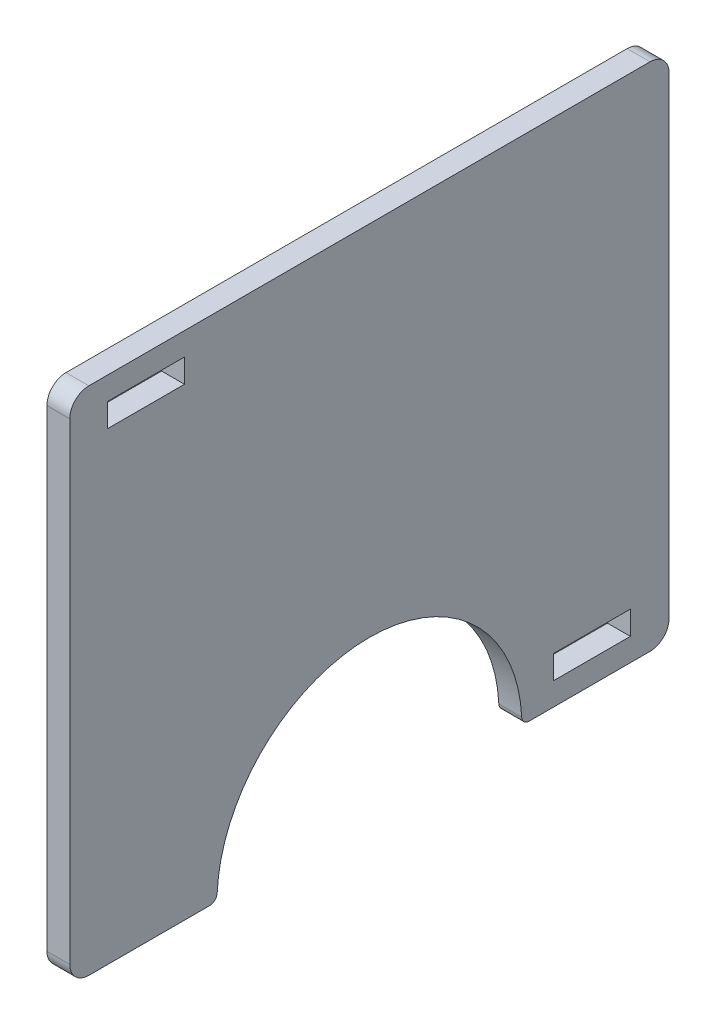
ISO-10303-21;
HEADER;
FILE_DESCRIPTION(('STEP AP214'),'2;1');
FILE_NAME('part.step','',(''),(''),'','','');
FILE_SCHEMA(('AUTOMOTIVE_DESIGN { 1 0 10303 214 1 1 1 1 }'));
ENDSEC;
DATA;
#1=APPLICATION_CONTEXT('core data for automotive mechanical design processes');
#2=APPLICATION_PROTOCOL_DEFINITION('international standard','automotive_design',2000,#1);
#3=PRODUCT_CONTEXT('',#1,'mechanical');
#4=PRODUCT('Part','Part','',(#3));
#5=PRODUCT_RELATED_PRODUCT_CATEGORY('part','',(#4));
#6=PRODUCT_DEFINITION_FORMATION('','',#4);
#7=PRODUCT_DEFINITION_CONTEXT('part definition',#1,'design');
#8=PRODUCT_DEFINITION('design','',#6,#7);
#9=PRODUCT_DEFINITION_SHAPE('','',#8);
#10=(LENGTH_UNIT() NAMED_UNIT(*) SI_UNIT(.MILLI.,.METRE.));
#11=(NAMED_UNIT(*) PLANE_ANGLE_UNIT() SI_UNIT($,.RADIAN.));
#12=(NAMED_UNIT(*) SI_UNIT($,.STERADIAN.) SOLID_ANGLE_UNIT());
#13=UNCERTAINTY_MEASURE_WITH_UNIT(LENGTH_MEASURE(1.E-05),#10,'distance_accuracy_value','');
#14=(GEOMETRIC_REPRESENTATION_CONTEXT(3) GLOBAL_UNCERTAINTY_ASSIGNED_CONTEXT((#13)) GLOBAL_UNIT_ASSIGNED_CONTEXT((#10,
#11,#12)) REPRESENTATION_CONTEXT('',''));
#15=CARTESIAN_POINT('',(0.,0.,0.));
#16=DIRECTION('',(0.,0.,1.));
#17=DIRECTION('',(1.,0.,0.));
#18=AXIS2_PLACEMENT_3D('',#15,#16,#17);
#19=CARTESIAN_POINT('',(3.,-33.5,36.82));
#20=DIRECTION('',(0.,1.,0.));
#21=DIRECTION('',(0.,0.,1.));
#22=AXIS2_PLACEMENT_3D('',#19,#20,#21);
#23=PLANE('',#22);
#24=DIRECTION('',(0.,0.,-1.));
#25=VECTOR('',#24,1.);
#26=CARTESIAN_POINT('',(0.,-33.5,36.82));
#27=LINE('',#26,#25);
#28=CARTESIAN_POINT('',(0.,-33.5,36.82));
#29=VERTEX_POINT('',#28);
#30=CARTESIAN_POINT('',(0.,-33.5,20.9761769634031));
#31=VERTEX_POINT('',#30);
#32=EDGE_CURVE('E274',#29,#31,#27,.T.);
#33=ORIENTED_EDGE('',*,*,#32,.T.);
#34=DIRECTION('',(1.,0.,0.));
#35=VECTOR('',#34,1.);
#36=CARTESIAN_POINT('',(3.,-33.5,20.9761769634031));
#37=LINE('',#36,#35);
#38=CARTESIAN_POINT('',(3.,-33.5,20.9761769634031));
#39=VERTEX_POINT('',#38);
#40=EDGE_CURVE('E11',#31,#39,#37,.T.);
#41=ORIENTED_EDGE('',*,*,#40,.T.);
#42=DIRECTION('',(0.,0.,-1.));
#43=VECTOR('',#42,1.);
#44=CARTESIAN_POINT('',(3.,-33.5,36.82));
#45=LINE('',#44,#43);
#46=CARTESIAN_POINT('',(3.,-33.5,36.82));
#47=VERTEX_POINT('',#46);
#48=EDGE_CURVE('E256',#47,#39,#45,.T.);
#49=ORIENTED_EDGE('',*,*,#48,.F.);
#50=DIRECTION('',(-1.,0.,0.));
#51=VECTOR('',#50,1.);
#52=CARTESIAN_POINT('',(3.,-33.5,36.82));
#53=LINE('',#52,#51);
#54=EDGE_CURVE('E308',#47,#29,#53,.T.);
#55=ORIENTED_EDGE('',*,*,#54,.T.);
#56=EDGE_LOOP('',(#33,#41,#49,#55));
#57=FACE_BOUND('',#56,.T.);
#58=ADVANCED_FACE('F33',(#57),#23,.F.);
#59=CARTESIAN_POINT('',(3.,-31.,36.82));
#60=DIRECTION('',(-1.,0.,0.));
#61=DIRECTION('',(0.,0.,1.));
#62=AXIS2_PLACEMENT_3D('',#59,#60,#61);
#63=CYLINDRICAL_SURFACE('',#62,2.5);
#64=CARTESIAN_POINT('',(0.,-31.,36.82));
#65=DIRECTION('',(1.,0.,0.));
#66=DIRECTION('',(0.,0.,-1.));
#67=AXIS2_PLACEMENT_3D('',#64,#65,#66);
#68=CIRCLE('',#67,2.5);
#69=CARTESIAN_POINT('',(0.,-31.,39.32));
#70=VERTEX_POINT('',#69);
#71=EDGE_CURVE('E250',#70,#29,#68,.T.);
#72=ORIENTED_EDGE('',*,*,#71,.T.);
#73=ORIENTED_EDGE('',*,*,#54,.F.);
#74=CARTESIAN_POINT('',(3.,-31.,36.82));
#75=DIRECTION('',(1.,0.,0.));
#76=DIRECTION('',(0.,0.,-1.));
#77=AXIS2_PLACEMENT_3D('',#74,#75,#76);
#78=CIRCLE('',#77,2.5);
#79=CARTESIAN_POINT('',(3.,-31.,39.32));
#80=VERTEX_POINT('',#79);
#81=EDGE_CURVE('E251',#80,#47,#78,.T.);
#82=ORIENTED_EDGE('',*,*,#81,.F.);
#83=DIRECTION('',(-1.,0.,0.));
#84=VECTOR('',#83,1.);
#85=CARTESIAN_POINT('',(3.,-31.,39.32));
#86=LINE('',#85,#84);
#87=EDGE_CURVE('E270',#80,#70,#86,.T.);
#88=ORIENTED_EDGE('',*,*,#87,.T.);
#89=EDGE_LOOP('',(#72,#73,#82,#88));
#90=FACE_BOUND('',#89,.T.);
#91=ADVANCED_FACE('F344',(#90),#63,.T.);
#92=CARTESIAN_POINT('',(3.,-33.5,-20.976176963403));
#93=VERTEX_POINT('',#92);
#94=CARTESIAN_POINT('',(3.,-33.5,-36.82));
#95=VERTEX_POINT('',#94);
#96=EDGE_CURVE('E254',#93,#95,#45,.T.);
#97=ORIENTED_EDGE('',*,*,#96,.F.);
#98=DIRECTION('',(1.,0.,0.));
#99=VECTOR('',#98,1.);
#100=CARTESIAN_POINT('',(3.,-33.5,-20.976176963403));
#101=LINE('',#100,#99);
#102=CARTESIAN_POINT('',(0.,-33.5,-20.976176963403));
#103=VERTEX_POINT('',#102);
#104=EDGE_CURVE('E311',#93,#103,#101,.F.);
#105=ORIENTED_EDGE('',*,*,#104,.T.);
#106=CARTESIAN_POINT('',(0.,-33.5,-36.82));
#107=VERTEX_POINT('',#106);
#108=EDGE_CURVE('E273',#103,#107,#27,.T.);
#109=ORIENTED_EDGE('',*,*,#108,.T.);
#110=DIRECTION('',(-1.,0.,0.));
#111=VECTOR('',#110,1.);
#112=CARTESIAN_POINT('',(3.,-33.5,-36.82));
#113=LINE('',#112,#111);
#114=EDGE_CURVE('E305',#95,#107,#113,.T.);
#115=ORIENTED_EDGE('',*,*,#114,.F.);
#116=EDGE_LOOP('',(#97,#105,#109,#115));
#117=FACE_BOUND('',#116,.T.);
#118=ADVANCED_FACE('F330',(#117),#23,.F.);
#119=CARTESIAN_POINT('',(3.,-31.,-36.82));
#120=DIRECTION('',(-1.,0.,0.));
#121=DIRECTION('',(0.,0.,1.));
#122=AXIS2_PLACEMENT_3D('',#119,#120,#121);
#123=CYLINDRICAL_SURFACE('',#122,2.5);
#124=CARTESIAN_POINT('',(0.,-31.,-36.82));
#125=DIRECTION('',(1.,0.,0.));
#126=DIRECTION('',(0.,0.,-1.));
#127=AXIS2_PLACEMENT_3D('',#124,#125,#126);
#128=CIRCLE('',#127,2.5);
#129=CARTESIAN_POINT('',(0.,-31.,-39.32));
#130=VERTEX_POINT('',#129);
#131=EDGE_CURVE('E277',#107,#130,#128,.T.);
#132=ORIENTED_EDGE('',*,*,#131,.T.);
#133=DIRECTION('',(-1.,0.,0.));
#134=VECTOR('',#133,1.);
#135=CARTESIAN_POINT('',(3.,-31.,-39.32));
#136=LINE('',#135,#134);
#137=CARTESIAN_POINT('',(3.,-31.,-39.32));
#138=VERTEX_POINT('',#137);
#139=EDGE_CURVE('E302',#138,#130,#136,.T.);
#140=ORIENTED_EDGE('',*,*,#139,.F.);
#141=CARTESIAN_POINT('',(3.,-31.,-36.82));
#142=DIRECTION('',(1.,0.,0.));
#143=DIRECTION('',(0.,0.,-1.));
#144=AXIS2_PLACEMENT_3D('',#141,#142,#143);
#145=CIRCLE('',#144,2.5);
#146=EDGE_CURVE('E258',#95,#138,#145,.T.);
#147=ORIENTED_EDGE('',*,*,#146,.F.);
#148=ORIENTED_EDGE('',*,*,#114,.T.);
#149=EDGE_LOOP('',(#132,#140,#147,#148));
#150=FACE_BOUND('',#149,.T.);
#151=ADVANCED_FACE('F372',(#150),#123,.T.);
#152=CARTESIAN_POINT('',(3.,31.,-39.32));
#153=DIRECTION('',(0.,0.,1.));
#154=DIRECTION('',(1.,0.,0.));
#155=AXIS2_PLACEMENT_3D('',#152,#153,#154);
#156=PLANE('',#155);
#157=DIRECTION('',(0.,1.,0.));
#158=VECTOR('',#157,1.);
#159=CARTESIAN_POINT('',(0.,31.,-39.32));
#160=LINE('',#159,#158);
#161=CARTESIAN_POINT('',(0.,31.,-39.32));
#162=VERTEX_POINT('',#161);
#163=EDGE_CURVE('E279',#130,#162,#160,.T.);
#164=ORIENTED_EDGE('',*,*,#163,.T.);
#165=DIRECTION('',(-1.,0.,0.));
#166=VECTOR('',#165,1.);
#167=CARTESIAN_POINT('',(3.,31.,-39.32));
#168=LINE('',#167,#166);
#169=CARTESIAN_POINT('',(3.,31.,-39.32));
#170=VERTEX_POINT('',#169);
#171=EDGE_CURVE('E299',#170,#162,#168,.T.);
#172=ORIENTED_EDGE('',*,*,#171,.F.);
#173=DIRECTION('',(0.,1.,0.));
#174=VECTOR('',#173,1.);
#175=CARTESIAN_POINT('',(3.,31.,-39.32));
#176=LINE('',#175,#174);
#177=EDGE_CURVE('E260',#138,#170,#176,.T.);
#178=ORIENTED_EDGE('',*,*,#177,.F.);
#179=ORIENTED_EDGE('',*,*,#139,.T.);
#180=EDGE_LOOP('',(#164,#172,#178,#179));
#181=FACE_BOUND('',#180,.T.);
#182=ADVANCED_FACE('F369',(#181),#156,.F.);
#183=CARTESIAN_POINT('',(3.,31.,-36.82));
#184=DIRECTION('',(-1.,0.,0.));
#185=DIRECTION('',(0.,0.,1.));
#186=AXIS2_PLACEMENT_3D('',#183,#184,#185);
#187=CYLINDRICAL_SURFACE('',#186,2.5);
#188=CARTESIAN_POINT('',(0.,31.,-36.82));
#189=DIRECTION('',(1.,0.,0.));
#190=DIRECTION('',(0.,0.,1.));
#191=AXIS2_PLACEMENT_3D('',#188,#189,#190);
#192=CIRCLE('',#191,2.5);
#193=CARTESIAN_POINT('',(0.,33.5,-36.82));
#194=VERTEX_POINT('',#193);
#195=EDGE_CURVE('E281',#162,#194,#192,.T.);
#196=ORIENTED_EDGE('',*,*,#195,.T.);
#197=DIRECTION('',(-1.,0.,0.));
#198=VECTOR('',#197,1.);
#199=CARTESIAN_POINT('',(3.,33.5,-36.82));
#200=LINE('',#199,#198);
#201=CARTESIAN_POINT('',(3.,33.5,-36.82));
#202=VERTEX_POINT('',#201);
#203=EDGE_CURVE('E296',#202,#194,#200,.T.);
#204=ORIENTED_EDGE('',*,*,#203,.F.);
#205=CARTESIAN_POINT('',(3.,31.,-36.82));
#206=DIRECTION('',(1.,0.,0.));
#207=DIRECTION('',(0.,0.,1.));
#208=AXIS2_PLACEMENT_3D('',#205,#206,#207);
#209=CIRCLE('',#208,2.5);
#210=EDGE_CURVE('E262',#170,#202,#209,.T.);
#211=ORIENTED_EDGE('',*,*,#210,.F.);
#212=ORIENTED_EDGE('',*,*,#171,.T.);
#213=EDGE_LOOP('',(#196,#204,#211,#212));
#214=FACE_BOUND('',#213,.T.);
#215=ADVANCED_FACE('F364',(#214),#187,.T.);
#216=CARTESIAN_POINT('',(3.,33.5,36.82));
#217=DIRECTION('',(0.,-1.,0.));
#218=DIRECTION('',(0.,0.,-1.));
#219=AXIS2_PLACEMENT_3D('',#216,#217,#218);
#220=PLANE('',#219);
#221=DIRECTION('',(0.,0.,1.));
#222=VECTOR('',#221,1.);
#223=CARTESIAN_POINT('',(0.,33.5,36.82));
#224=LINE('',#223,#222);
#225=CARTESIAN_POINT('',(0.,33.5,36.82));
#226=VERTEX_POINT('',#225);
#227=EDGE_CURVE('E283',#194,#226,#224,.T.);
#228=ORIENTED_EDGE('',*,*,#227,.T.);
#229=DIRECTION('',(-1.,0.,0.));
#230=VECTOR('',#229,1.);
#231=CARTESIAN_POINT('',(3.,33.5,36.82));
#232=LINE('',#231,#230);
#233=CARTESIAN_POINT('',(3.,33.5,36.82));
#234=VERTEX_POINT('',#233);
#235=EDGE_CURVE('E293',#234,#226,#232,.T.);
#236=ORIENTED_EDGE('',*,*,#235,.F.);
#237=DIRECTION('',(0.,0.,1.));
#238=VECTOR('',#237,1.);
#239=CARTESIAN_POINT('',(3.,33.5,36.82));
#240=LINE('',#239,#238);
#241=EDGE_CURVE('E264',#202,#234,#240,.T.);
#242=ORIENTED_EDGE('',*,*,#241,.F.);
#243=ORIENTED_EDGE('',*,*,#203,.T.);
#244=EDGE_LOOP('',(#228,#236,#242,#243));
#245=FACE_BOUND('',#244,.T.);
#246=ADVANCED_FACE('F359',(#245),#220,.F.);
#247=CARTESIAN_POINT('',(3.,31.,36.82));
#248=DIRECTION('',(-1.,0.,0.));
#249=DIRECTION('',(0.,0.,1.));
#250=AXIS2_PLACEMENT_3D('',#247,#248,#249);
#251=CYLINDRICAL_SURFACE('',#250,2.5);
#252=CARTESIAN_POINT('',(0.,31.,36.82));
#253=DIRECTION('',(1.,0.,0.));
#254=DIRECTION('',(0.,0.,-1.));
#255=AXIS2_PLACEMENT_3D('',#252,#253,#254);
#256=CIRCLE('',#255,2.5);
#257=CARTESIAN_POINT('',(0.,31.,39.32));
#258=VERTEX_POINT('',#257);
#259=EDGE_CURVE('E285',#226,#258,#256,.T.);
#260=ORIENTED_EDGE('',*,*,#259,.T.);
#261=DIRECTION('',(-1.,0.,0.));
#262=VECTOR('',#261,1.);
#263=CARTESIAN_POINT('',(3.,31.,39.32));
#264=LINE('',#263,#262);
#265=CARTESIAN_POINT('',(3.,31.,39.32));
#266=VERTEX_POINT('',#265);
#267=EDGE_CURVE('E290',#266,#258,#264,.T.);
#268=ORIENTED_EDGE('',*,*,#267,.F.);
#269=CARTESIAN_POINT('',(3.,31.,36.82));
#270=DIRECTION('',(1.,0.,0.));
#271=DIRECTION('',(0.,0.,-1.));
#272=AXIS2_PLACEMENT_3D('',#269,#270,#271);
#273=CIRCLE('',#272,2.5);
#274=EDGE_CURVE('E266',#234,#266,#273,.T.);
#275=ORIENTED_EDGE('',*,*,#274,.F.);
#276=ORIENTED_EDGE('',*,*,#235,.T.);
#277=EDGE_LOOP('',(#260,#268,#275,#276));
#278=FACE_BOUND('',#277,.T.);
#279=ADVANCED_FACE('F355',(#278),#251,.T.);
#280=CARTESIAN_POINT('',(3.,31.,39.32));
#281=DIRECTION('',(0.,0.,-1.));
#282=DIRECTION('',(0.,1.,0.));
#283=AXIS2_PLACEMENT_3D('',#280,#281,#282);
#284=PLANE('',#283);
#285=DIRECTION('',(0.,-1.,0.));
#286=VECTOR('',#285,1.);
#287=CARTESIAN_POINT('',(0.,31.,39.32));
#288=LINE('',#287,#286);
#289=EDGE_CURVE('E255',#258,#70,#288,.T.);
#290=ORIENTED_EDGE('',*,*,#289,.T.);
#291=ORIENTED_EDGE('',*,*,#87,.F.);
#292=DIRECTION('',(0.,-1.,0.));
#293=VECTOR('',#292,1.);
#294=CARTESIAN_POINT('',(3.,31.,39.32));
#295=LINE('',#294,#293);
#296=EDGE_CURVE('E268',#266,#80,#295,.T.);
#297=ORIENTED_EDGE('',*,*,#296,.F.);
#298=ORIENTED_EDGE('',*,*,#267,.T.);
#299=EDGE_LOOP('',(#290,#291,#297,#298));
#300=FACE_BOUND('',#299,.T.);
#301=ADVANCED_FACE('F350',(#300),#284,.F.);
#302=CARTESIAN_POINT('',(3.,-31.,36.82));
#303=DIRECTION('',(1.,0.,0.));
#304=DIRECTION('',(0.,0.,-1.));
#305=AXIS2_PLACEMENT_3D('',#302,#303,#304);
#306=PLANE('',#305);
#307=DIRECTION('',(0.,-1.,0.));
#308=VECTOR('',#307,1.);
#309=CARTESIAN_POINT('',(3.,-31.,34.37));
#310=LINE('',#309,#308);
#311=CARTESIAN_POINT('',(3.,30.5,34.37));
#312=VERTEX_POINT('',#311);
#313=CARTESIAN_POINT('',(3.,27.4,34.37));
#314=VERTEX_POINT('',#313);
#315=EDGE_CURVE('E247',#312,#314,#310,.T.);
#316=ORIENTED_EDGE('',*,*,#315,.F.);
#317=DIRECTION('',(0.,0.,1.));
#318=VECTOR('',#317,1.);
#319=CARTESIAN_POINT('',(3.,30.5,36.82));
#320=LINE('',#319,#318);
#321=CARTESIAN_POINT('',(3.,30.5,24.27));
#322=VERTEX_POINT('',#321);
#323=EDGE_CURVE('E245',#322,#312,#320,.T.);
#324=ORIENTED_EDGE('',*,*,#323,.F.);
#325=DIRECTION('',(0.,1.,0.));
#326=VECTOR('',#325,1.);
#327=CARTESIAN_POINT('',(3.,-31.,24.27));
#328=LINE('',#327,#326);
#329=CARTESIAN_POINT('',(3.,27.4,24.27));
#330=VERTEX_POINT('',#329);
#331=EDGE_CURVE('E243',#330,#322,#328,.T.);
#332=ORIENTED_EDGE('',*,*,#331,.F.);
#333=DIRECTION('',(0.,0.,-1.));
#334=VECTOR('',#333,1.);
#335=CARTESIAN_POINT('',(3.,27.4,36.82));
#336=LINE('',#335,#334);
#337=EDGE_CURVE('E241',#314,#330,#336,.T.);
#338=ORIENTED_EDGE('',*,*,#337,.F.);
#339=EDGE_LOOP('',(#316,#324,#332,#338));
#340=FACE_BOUND('',#339,.T.);
#341=DIRECTION('',(0.,1.,0.));
#342=VECTOR('',#341,1.);
#343=CARTESIAN_POINT('',(3.,-31.,-34.2349238703218));
#344=LINE('',#343,#342);
#345=CARTESIAN_POINT('',(3.,-30.5,-34.2349238703218));
#346=VERTEX_POINT('',#345);
#347=CARTESIAN_POINT('',(3.,-27.4,-34.2349238703218));
#348=VERTEX_POINT('',#347);
#349=EDGE_CURVE('E178',#346,#348,#344,.T.);
#350=ORIENTED_EDGE('',*,*,#349,.F.);
#351=DIRECTION('',(0.,0.,-1.));
#352=VECTOR('',#351,1.);
#353=CARTESIAN_POINT('',(3.,-30.5,36.82));
#354=LINE('',#353,#352);
#355=CARTESIAN_POINT('',(3.,-30.5,-24.1349238703218));
#356=VERTEX_POINT('',#355);
#357=EDGE_CURVE('E238',#356,#346,#354,.T.);
#358=ORIENTED_EDGE('',*,*,#357,.F.);
#359=DIRECTION('',(0.,-1.,0.));
#360=VECTOR('',#359,1.);
#361=CARTESIAN_POINT('',(3.,-31.,-24.1349238703218));
#362=LINE('',#361,#360);
#363=CARTESIAN_POINT('',(3.,-27.4,-24.1349238703218));
#364=VERTEX_POINT('',#363);
#365=EDGE_CURVE('E236',#364,#356,#362,.T.);
#366=ORIENTED_EDGE('',*,*,#365,.F.);
#367=DIRECTION('',(0.,0.,1.));
#368=VECTOR('',#367,1.);
#369=CARTESIAN_POINT('',(3.,-27.4,36.82));
#370=LINE('',#369,#368);
#371=EDGE_CURVE('E234',#348,#364,#370,.T.);
#372=ORIENTED_EDGE('',*,*,#371,.F.);
#373=EDGE_LOOP('',(#350,#358,#366,#372));
#374=FACE_BOUND('',#373,.T.);
#375=CARTESIAN_POINT('',(3.,-33.5,0.));
#376=DIRECTION('',(1.,0.,0.));
#377=DIRECTION('',(0.,0.,-1.));
#378=AXIS2_PLACEMENT_3D('',#375,#376,#377);
#379=CIRCLE('',#378,20.);
#380=CARTESIAN_POINT('',(3.,-32.547619047619,-19.9773113937172));
#381=VERTEX_POINT('',#380);
#382=CARTESIAN_POINT('',(3.,-32.547619047619,19.9773113937172));
#383=VERTEX_POINT('',#382);
#384=EDGE_CURVE('E232',#381,#383,#379,.T.);
#385=ORIENTED_EDGE('',*,*,#384,.F.);
#386=CARTESIAN_POINT('',(3.,-32.5,-20.976176963403));
#387=DIRECTION('',(1.,0.,0.));
#388=DIRECTION('',(0.,0.,-1.));
#389=AXIS2_PLACEMENT_3D('',#386,#387,#388);
#390=CIRCLE('',#389,1.);
#391=EDGE_CURVE('E41',#381,#93,#390,.T.);
#392=ORIENTED_EDGE('',*,*,#391,.T.);
#393=ORIENTED_EDGE('',*,*,#96,.T.);
#394=ORIENTED_EDGE('',*,*,#146,.T.);
#395=ORIENTED_EDGE('',*,*,#177,.T.);
#396=ORIENTED_EDGE('',*,*,#210,.T.);
#397=ORIENTED_EDGE('',*,*,#241,.T.);
#398=ORIENTED_EDGE('',*,*,#274,.T.);
#399=ORIENTED_EDGE('',*,*,#296,.T.);
#400=ORIENTED_EDGE('',*,*,#81,.T.);
#401=ORIENTED_EDGE('',*,*,#48,.T.);
#402=CARTESIAN_POINT('',(3.,-32.5,20.9761769634031));
#403=DIRECTION('',(1.,0.,0.));
#404=DIRECTION('',(0.,0.,-1.));
#405=AXIS2_PLACEMENT_3D('',#402,#403,#404);
#406=CIRCLE('',#405,1.);
#407=EDGE_CURVE('E48',#39,#383,#406,.T.);
#408=ORIENTED_EDGE('',*,*,#407,.T.);
#409=EDGE_LOOP('',(#385,#392,#393,#394,#395,#396,#397,#398,#399,#400,#401,#408));
#410=FACE_BOUND('',#409,.T.);
#411=ADVANCED_FACE('F324',(#340,#374,#410),#306,.T.);
#412=CARTESIAN_POINT('',(0.,-31.,36.82));
#413=DIRECTION('',(1.,0.,0.));
#414=DIRECTION('',(0.,0.,-1.));
#415=AXIS2_PLACEMENT_3D('',#412,#413,#414);
#416=PLANE('',#415);
#417=DIRECTION('',(0.,0.,1.));
#418=VECTOR('',#417,1.);
#419=CARTESIAN_POINT('',(0.,30.5,34.37));
#420=LINE('',#419,#418);
#421=CARTESIAN_POINT('',(0.,30.5,24.27));
#422=VERTEX_POINT('',#421);
#423=CARTESIAN_POINT('',(0.,30.5,34.37));
#424=VERTEX_POINT('',#423);
#425=EDGE_CURVE('E220',#422,#424,#420,.T.);
#426=ORIENTED_EDGE('',*,*,#425,.T.);
#427=DIRECTION('',(0.,-1.,0.));
#428=VECTOR('',#427,1.);
#429=CARTESIAN_POINT('',(0.,27.4,34.37));
#430=LINE('',#429,#428);
#431=CARTESIAN_POINT('',(0.,27.4,34.37));
#432=VERTEX_POINT('',#431);
#433=EDGE_CURVE('E211',#424,#432,#430,.T.);
#434=ORIENTED_EDGE('',*,*,#433,.T.);
#435=DIRECTION('',(0.,0.,-1.));
#436=VECTOR('',#435,1.);
#437=CARTESIAN_POINT('',(0.,27.4,34.37));
#438=LINE('',#437,#436);
#439=CARTESIAN_POINT('',(0.,27.4,24.27));
#440=VERTEX_POINT('',#439);
#441=EDGE_CURVE('E214',#432,#440,#438,.T.);
#442=ORIENTED_EDGE('',*,*,#441,.T.);
#443=DIRECTION('',(0.,1.,0.));
#444=VECTOR('',#443,1.);
#445=CARTESIAN_POINT('',(0.,27.4,24.27));
#446=LINE('',#445,#444);
#447=EDGE_CURVE('E217',#440,#422,#446,.T.);
#448=ORIENTED_EDGE('',*,*,#447,.T.);
#449=EDGE_LOOP('',(#426,#434,#442,#448));
#450=FACE_BOUND('',#449,.T.);
#451=DIRECTION('',(0.,0.,-1.));
#452=VECTOR('',#451,1.);
#453=CARTESIAN_POINT('',(0.,-30.5,-34.2349238703218));
#454=LINE('',#453,#452);
#455=CARTESIAN_POINT('',(0.,-30.5,-24.1349238703218));
#456=VERTEX_POINT('',#455);
#457=CARTESIAN_POINT('',(0.,-30.5,-34.2349238703218));
#458=VERTEX_POINT('',#457);
#459=EDGE_CURVE('E182',#456,#458,#454,.T.);
#460=ORIENTED_EDGE('',*,*,#459,.T.);
#461=DIRECTION('',(0.,1.,0.));
#462=VECTOR('',#461,1.);
#463=CARTESIAN_POINT('',(0.,-30.5,-34.2349238703218));
#464=LINE('',#463,#462);
#465=CARTESIAN_POINT('',(0.,-27.4,-34.2349238703218));
#466=VERTEX_POINT('',#465);
#467=EDGE_CURVE('E175',#458,#466,#464,.T.);
#468=ORIENTED_EDGE('',*,*,#467,.T.);
#469=DIRECTION('',(0.,0.,1.));
#470=VECTOR('',#469,1.);
#471=CARTESIAN_POINT('',(0.,-27.4,-34.2349238703218));
#472=LINE('',#471,#470);
#473=CARTESIAN_POINT('',(0.,-27.4,-24.1349238703218));
#474=VERTEX_POINT('',#473);
#475=EDGE_CURVE('E186',#466,#474,#472,.T.);
#476=ORIENTED_EDGE('',*,*,#475,.T.);
#477=DIRECTION('',(0.,-1.,0.));
#478=VECTOR('',#477,1.);
#479=CARTESIAN_POINT('',(0.,-30.5,-24.1349238703218));
#480=LINE('',#479,#478);
#481=EDGE_CURVE('E191',#474,#456,#480,.T.);
#482=ORIENTED_EDGE('',*,*,#481,.T.);
#483=EDGE_LOOP('',(#460,#468,#476,#482));
#484=FACE_BOUND('',#483,.T.);
#485=ORIENTED_EDGE('',*,*,#108,.F.);
#486=CARTESIAN_POINT('',(0.,-32.5,-20.976176963403));
#487=DIRECTION('',(1.,0.,0.));
#488=DIRECTION('',(0.,0.,-1.));
#489=AXIS2_PLACEMENT_3D('',#486,#487,#488);
#490=CIRCLE('',#489,1.);
#491=CARTESIAN_POINT('',(0.,-32.547619047619,-19.9773113937172));
#492=VERTEX_POINT('',#491);
#493=EDGE_CURVE('E316',#103,#492,#490,.F.);
#494=ORIENTED_EDGE('',*,*,#493,.T.);
#495=CARTESIAN_POINT('',(0.,-33.5,0.));
#496=DIRECTION('',(1.,0.,0.));
#497=DIRECTION('',(0.,0.,-1.));
#498=AXIS2_PLACEMENT_3D('',#495,#496,#497);
#499=CIRCLE('',#498,20.);
#500=CARTESIAN_POINT('',(0.,-32.547619047619,19.9773113937172));
#501=VERTEX_POINT('',#500);
#502=EDGE_CURVE('E206',#492,#501,#499,.T.);
#503=ORIENTED_EDGE('',*,*,#502,.T.);
#504=CARTESIAN_POINT('',(0.,-32.5,20.9761769634031));
#505=DIRECTION('',(1.,0.,0.));
#506=DIRECTION('',(0.,0.,-1.));
#507=AXIS2_PLACEMENT_3D('',#504,#505,#506);
#508=CIRCLE('',#507,1.);
#509=EDGE_CURVE('E314',#501,#31,#508,.F.);
#510=ORIENTED_EDGE('',*,*,#509,.T.);
#511=ORIENTED_EDGE('',*,*,#32,.F.);
#512=ORIENTED_EDGE('',*,*,#71,.F.);
#513=ORIENTED_EDGE('',*,*,#289,.F.);
#514=ORIENTED_EDGE('',*,*,#259,.F.);
#515=ORIENTED_EDGE('',*,*,#227,.F.);
#516=ORIENTED_EDGE('',*,*,#195,.F.);
#517=ORIENTED_EDGE('',*,*,#163,.F.);
#518=ORIENTED_EDGE('',*,*,#131,.F.);
#519=EDGE_LOOP('',(#485,#494,#503,#510,#511,#512,#513,#514,#515,#516,#517,#518));
#520=FACE_BOUND('',#519,.T.);
#521=ADVANCED_FACE('F193',(#450,#484,#520),#416,.F.);
#522=CARTESIAN_POINT('',(0.,-33.5,0.));
#523=DIRECTION('',(1.,0.,0.));
#524=DIRECTION('',(0.,0.,-1.));
#525=AXIS2_PLACEMENT_3D('',#522,#523,#524);
#526=CYLINDRICAL_SURFACE('',#525,20.);
#527=ORIENTED_EDGE('',*,*,#502,.F.);
#528=DIRECTION('',(1.,0.,0.));
#529=VECTOR('',#528,1.);
#530=CARTESIAN_POINT('',(0.,-32.547619047619,-19.9773113937172));
#531=LINE('',#530,#529);
#532=EDGE_CURVE('E320',#492,#381,#531,.T.);
#533=ORIENTED_EDGE('',*,*,#532,.T.);
#534=ORIENTED_EDGE('',*,*,#384,.T.);
#535=DIRECTION('',(1.,0.,0.));
#536=VECTOR('',#535,1.);
#537=CARTESIAN_POINT('',(0.,-32.547619047619,19.9773113937172));
#538=LINE('',#537,#536);
#539=EDGE_CURVE('E318',#383,#501,#538,.F.);
#540=ORIENTED_EDGE('',*,*,#539,.T.);
#541=EDGE_LOOP('',(#527,#533,#534,#540));
#542=FACE_BOUND('',#541,.T.);
#543=ADVANCED_FACE('F338',(#542),#526,.F.);
#544=CARTESIAN_POINT('',(0.,-30.5,-34.2349238703218));
#545=DIRECTION('',(0.,0.,-1.));
#546=DIRECTION('',(-1.,0.,0.));
#547=AXIS2_PLACEMENT_3D('',#544,#545,#546);
#548=PLANE('',#547);
#549=ORIENTED_EDGE('',*,*,#349,.T.);
#550=DIRECTION('',(1.,0.,0.));
#551=VECTOR('',#550,1.);
#552=CARTESIAN_POINT('',(0.,-27.4,-34.2349238703218));
#553=LINE('',#552,#551);
#554=EDGE_CURVE('E170',#466,#348,#553,.T.);
#555=ORIENTED_EDGE('',*,*,#554,.F.);
#556=ORIENTED_EDGE('',*,*,#467,.F.);
#557=DIRECTION('',(1.,0.,0.));
#558=VECTOR('',#557,1.);
#559=CARTESIAN_POINT('',(0.,-30.5,-34.2349238703218));
#560=LINE('',#559,#558);
#561=EDGE_CURVE('E204',#458,#346,#560,.T.);
#562=ORIENTED_EDGE('',*,*,#561,.T.);
#563=EDGE_LOOP('',(#549,#555,#556,#562));
#564=FACE_BOUND('',#563,.T.);
#565=ADVANCED_FACE('F172',(#564),#548,.F.);
#566=CARTESIAN_POINT('',(0.,-30.5,-34.2349238703218));
#567=DIRECTION('',(0.,-1.,0.));
#568=DIRECTION('',(0.,0.,-1.));
#569=AXIS2_PLACEMENT_3D('',#566,#567,#568);
#570=PLANE('',#569);
#571=ORIENTED_EDGE('',*,*,#357,.T.);
#572=ORIENTED_EDGE('',*,*,#561,.F.);
#573=ORIENTED_EDGE('',*,*,#459,.F.);
#574=DIRECTION('',(1.,0.,0.));
#575=VECTOR('',#574,1.);
#576=CARTESIAN_POINT('',(0.,-30.5,-24.1349238703218));
#577=LINE('',#576,#575);
#578=EDGE_CURVE('E207',#456,#356,#577,.T.);
#579=ORIENTED_EDGE('',*,*,#578,.T.);
#580=EDGE_LOOP('',(#571,#572,#573,#579));
#581=FACE_BOUND('',#580,.T.);
#582=ADVANCED_FACE('F465',(#581),#570,.F.);
#583=CARTESIAN_POINT('',(0.,-30.5,-24.1349238703218));
#584=DIRECTION('',(0.,0.,1.));
#585=DIRECTION('',(1.,0.,0.));
#586=AXIS2_PLACEMENT_3D('',#583,#584,#585);
#587=PLANE('',#586);
#588=ORIENTED_EDGE('',*,*,#365,.T.);
#589=ORIENTED_EDGE('',*,*,#578,.F.);
#590=ORIENTED_EDGE('',*,*,#481,.F.);
#591=DIRECTION('',(1.,0.,0.));
#592=VECTOR('',#591,1.);
#593=CARTESIAN_POINT('',(0.,-27.4,-24.1349238703218));
#594=LINE('',#593,#592);
#595=EDGE_CURVE('E181',#474,#364,#594,.T.);
#596=ORIENTED_EDGE('',*,*,#595,.T.);
#597=EDGE_LOOP('',(#588,#589,#590,#596));
#598=FACE_BOUND('',#597,.T.);
#599=ADVANCED_FACE('F471',(#598),#587,.F.);
#600=CARTESIAN_POINT('',(0.,-27.4,-34.2349238703218));
#601=DIRECTION('',(0.,1.,0.));
#602=DIRECTION('',(0.,0.,1.));
#603=AXIS2_PLACEMENT_3D('',#600,#601,#602);
#604=PLANE('',#603);
#605=ORIENTED_EDGE('',*,*,#371,.T.);
#606=ORIENTED_EDGE('',*,*,#595,.F.);
#607=ORIENTED_EDGE('',*,*,#475,.F.);
#608=ORIENTED_EDGE('',*,*,#554,.T.);
#609=EDGE_LOOP('',(#605,#606,#607,#608));
#610=FACE_BOUND('',#609,.T.);
#611=ADVANCED_FACE('F187',(#610),#604,.F.);
#612=CARTESIAN_POINT('',(0.,27.4,34.37));
#613=DIRECTION('',(0.,0.,1.));
#614=DIRECTION('',(1.,0.,0.));
#615=AXIS2_PLACEMENT_3D('',#612,#613,#614);
#616=PLANE('',#615);
#617=ORIENTED_EDGE('',*,*,#315,.T.);
#618=DIRECTION('',(1.,0.,0.));
#619=VECTOR('',#618,1.);
#620=CARTESIAN_POINT('',(0.,27.4,34.37));
#621=LINE('',#620,#619);
#622=EDGE_CURVE('E222',#432,#314,#621,.T.);
#623=ORIENTED_EDGE('',*,*,#622,.F.);
#624=ORIENTED_EDGE('',*,*,#433,.F.);
#625=DIRECTION('',(1.,0.,0.));
#626=VECTOR('',#625,1.);
#627=CARTESIAN_POINT('',(0.,30.5,34.37));
#628=LINE('',#627,#626);
#629=EDGE_CURVE('E196',#424,#312,#628,.T.);
#630=ORIENTED_EDGE('',*,*,#629,.T.);
#631=EDGE_LOOP('',(#617,#623,#624,#630));
#632=FACE_BOUND('',#631,.T.);
#633=ADVANCED_FACE('F404',(#632),#616,.F.);
#634=CARTESIAN_POINT('',(0.,30.5,34.37));
#635=DIRECTION('',(0.,1.,0.));
#636=DIRECTION('',(0.,0.,1.));
#637=AXIS2_PLACEMENT_3D('',#634,#635,#636);
#638=PLANE('',#637);
#639=ORIENTED_EDGE('',*,*,#323,.T.);
#640=ORIENTED_EDGE('',*,*,#629,.F.);
#641=ORIENTED_EDGE('',*,*,#425,.F.);
#642=DIRECTION('',(1.,0.,0.));
#643=VECTOR('',#642,1.);
#644=CARTESIAN_POINT('',(0.,30.5,24.27));
#645=LINE('',#644,#643);
#646=EDGE_CURVE('E199',#422,#322,#645,.T.);
#647=ORIENTED_EDGE('',*,*,#646,.T.);
#648=EDGE_LOOP('',(#639,#640,#641,#647));
#649=FACE_BOUND('',#648,.T.);
#650=ADVANCED_FACE('F399',(#649),#638,.F.);
#651=CARTESIAN_POINT('',(0.,27.4,24.27));
#652=DIRECTION('',(0.,0.,-1.));
#653=DIRECTION('',(-1.,0.,0.));
#654=AXIS2_PLACEMENT_3D('',#651,#652,#653);
#655=PLANE('',#654);
#656=ORIENTED_EDGE('',*,*,#331,.T.);
#657=ORIENTED_EDGE('',*,*,#646,.F.);
#658=ORIENTED_EDGE('',*,*,#447,.F.);
#659=DIRECTION('',(1.,0.,0.));
#660=VECTOR('',#659,1.);
#661=CARTESIAN_POINT('',(0.,27.4,24.27));
#662=LINE('',#661,#660);
#663=EDGE_CURVE('E226',#440,#330,#662,.T.);
#664=ORIENTED_EDGE('',*,*,#663,.T.);
#665=EDGE_LOOP('',(#656,#657,#658,#664));
#666=FACE_BOUND('',#665,.T.);
#667=ADVANCED_FACE('F394',(#666),#655,.F.);
#668=CARTESIAN_POINT('',(0.,27.4,34.37));
#669=DIRECTION('',(0.,-1.,0.));
#670=DIRECTION('',(0.,0.,-1.));
#671=AXIS2_PLACEMENT_3D('',#668,#669,#670);
#672=PLANE('',#671);
#673=ORIENTED_EDGE('',*,*,#337,.T.);
#674=ORIENTED_EDGE('',*,*,#663,.F.);
#675=ORIENTED_EDGE('',*,*,#441,.F.);
#676=ORIENTED_EDGE('',*,*,#622,.T.);
#677=EDGE_LOOP('',(#673,#674,#675,#676));
#678=FACE_BOUND('',#677,.T.);
#679=ADVANCED_FACE('F389',(#678),#672,.F.);
#680=CARTESIAN_POINT('',(0.,-32.5,-20.976176963403));
#681=DIRECTION('',(1.,0.,0.));
#682=DIRECTION('',(0.,0.,-1.));
#683=AXIS2_PLACEMENT_3D('',#680,#681,#682);
#684=CYLINDRICAL_SURFACE('',#683,1.);
#685=ORIENTED_EDGE('',*,*,#391,.F.);
#686=ORIENTED_EDGE('',*,*,#532,.F.);
#687=ORIENTED_EDGE('',*,*,#493,.F.);
#688=ORIENTED_EDGE('',*,*,#104,.F.);
#689=EDGE_LOOP('',(#685,#686,#687,#688));
#690=FACE_BOUND('',#689,.T.);
#691=ADVANCED_FACE('F333',(#690),#684,.T.);
#692=CARTESIAN_POINT('',(0.,-32.5,20.9761769634031));
#693=DIRECTION('',(1.,0.,0.));
#694=DIRECTION('',(0.,0.,-1.));
#695=AXIS2_PLACEMENT_3D('',#692,#693,#694);
#696=CYLINDRICAL_SURFACE('',#695,1.);
#697=ORIENTED_EDGE('',*,*,#509,.F.);
#698=ORIENTED_EDGE('',*,*,#539,.F.);
#699=ORIENTED_EDGE('',*,*,#407,.F.);
#700=ORIENTED_EDGE('',*,*,#40,.F.);
#701=EDGE_LOOP('',(#697,#698,#699,#700));
#702=FACE_BOUND('',#701,.T.);
#703=ADVANCED_FACE('F35',(#702),#696,.T.);
#704=CLOSED_SHELL('',(#58,#91,#118,#151,#182,#215,#246,#279,#301,#411,#521,#543,#565,#582,#599,
#611,#633,#650,#667,#679,#691,#703));
#705=MANIFOLD_SOLID_BREP('B2',#704);
#706=ADVANCED_BREP_SHAPE_REPRESENTATION('',(#18,#705),#14);
#707=SHAPE_DEFINITION_REPRESENTATION(#9,#706);
ENDSEC;
END-ISO-10303-21;
